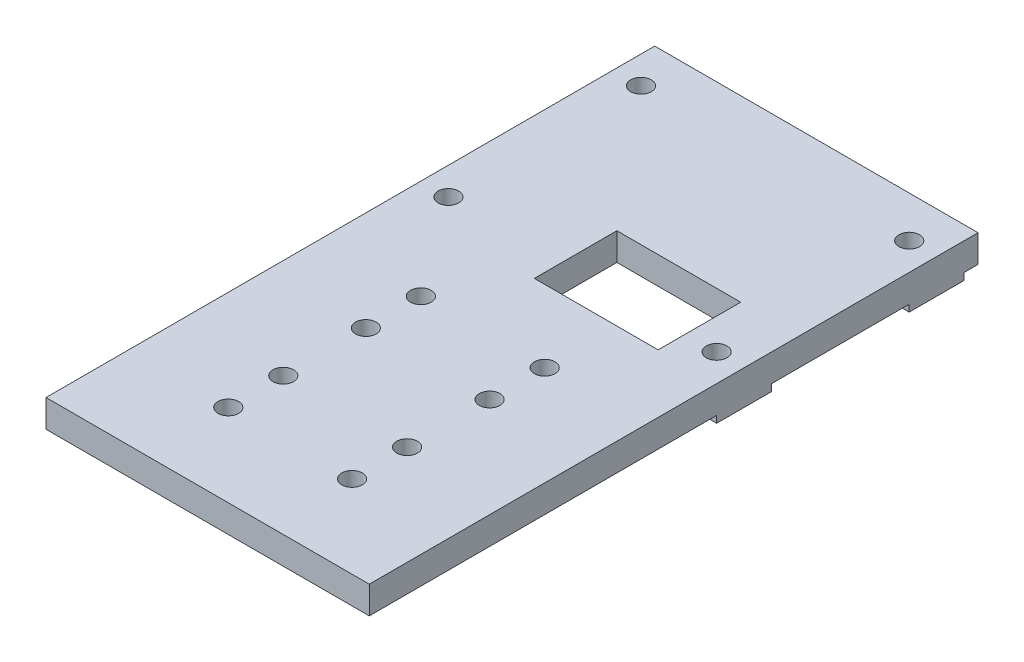
ISO-10303-21;
HEADER;
FILE_DESCRIPTION(('STEP AP214'),'2;1');
FILE_NAME('part.step','',(''),(''),'','','');
FILE_SCHEMA(('AUTOMOTIVE_DESIGN { 1 0 10303 214 1 1 1 1 }'));
ENDSEC;
DATA;
#1=APPLICATION_CONTEXT('core data for automotive mechanical design processes');
#2=APPLICATION_PROTOCOL_DEFINITION('international standard','automotive_design',2000,#1);
#3=PRODUCT_CONTEXT('',#1,'mechanical');
#4=PRODUCT('Part','Part','',(#3));
#5=PRODUCT_RELATED_PRODUCT_CATEGORY('part','',(#4));
#6=PRODUCT_DEFINITION_FORMATION('','',#4);
#7=PRODUCT_DEFINITION_CONTEXT('part definition',#1,'design');
#8=PRODUCT_DEFINITION('design','',#6,#7);
#9=PRODUCT_DEFINITION_SHAPE('','',#8);
#10=(LENGTH_UNIT() NAMED_UNIT(*) SI_UNIT(.MILLI.,.METRE.));
#11=(NAMED_UNIT(*) PLANE_ANGLE_UNIT() SI_UNIT($,.RADIAN.));
#12=(NAMED_UNIT(*) SI_UNIT($,.STERADIAN.) SOLID_ANGLE_UNIT());
#13=UNCERTAINTY_MEASURE_WITH_UNIT(LENGTH_MEASURE(1.E-05),#10,'distance_accuracy_value','');
#14=(GEOMETRIC_REPRESENTATION_CONTEXT(3) GLOBAL_UNCERTAINTY_ASSIGNED_CONTEXT((#13)) GLOBAL_UNIT_ASSIGNED_CONTEXT((#10,
#11,#12)) REPRESENTATION_CONTEXT('',''));
#15=CARTESIAN_POINT('',(0.,0.,0.));
#16=DIRECTION('',(0.,0.,1.));
#17=DIRECTION('',(1.,0.,0.));
#18=AXIS2_PLACEMENT_3D('',#15,#16,#17);
#19=CARTESIAN_POINT('',(0.,0.,0.));
#20=DIRECTION('',(0.,1.,0.));
#21=DIRECTION('',(0.,0.,1.));
#22=AXIS2_PLACEMENT_3D('',#19,#20,#21);
#23=PLANE('',#22);
#24=CARTESIAN_POINT('',(-9.,0.,28.5));
#25=DIRECTION('',(0.,1.,0.));
#26=DIRECTION('',(0.,0.,-1.));
#27=AXIS2_PLACEMENT_3D('',#24,#25,#26);
#28=CIRCLE('',#27,1.5);
#29=CARTESIAN_POINT('',(-9.,0.,27.));
#30=VERTEX_POINT('',#29);
#31=EDGE_CURVE('E211',#30,#30,#28,.T.);
#32=ORIENTED_EDGE('',*,*,#31,.T.);
#33=EDGE_LOOP('',(#32));
#34=FACE_BOUND('',#33,.T.);
#35=CARTESIAN_POINT('',(-9.,0.,48.5));
#36=DIRECTION('',(0.,1.,0.));
#37=DIRECTION('',(0.,0.,-1.));
#38=AXIS2_PLACEMENT_3D('',#35,#36,#37);
#39=CIRCLE('',#38,1.5);
#40=CARTESIAN_POINT('',(-9.,0.,47.));
#41=VERTEX_POINT('',#40);
#42=EDGE_CURVE('E841',#41,#41,#39,.T.);
#43=ORIENTED_EDGE('',*,*,#42,.T.);
#44=EDGE_LOOP('',(#43));
#45=FACE_BOUND('',#44,.T.);
#46=CARTESIAN_POINT('',(9.00000000000001,0.,48.5));
#47=DIRECTION('',(0.,1.,0.));
#48=DIRECTION('',(0.,0.,1.));
#49=AXIS2_PLACEMENT_3D('',#46,#47,#48);
#50=CIRCLE('',#49,1.5);
#51=CARTESIAN_POINT('',(9.00000000000001,0.,50.));
#52=VERTEX_POINT('',#51);
#53=EDGE_CURVE('E857',#52,#52,#50,.T.);
#54=ORIENTED_EDGE('',*,*,#53,.T.);
#55=EDGE_LOOP('',(#54));
#56=FACE_BOUND('',#55,.T.);
#57=CARTESIAN_POINT('',(9.00000000000001,0.,36.5));
#58=DIRECTION('',(0.,1.,0.));
#59=DIRECTION('',(0.,0.,1.));
#60=AXIS2_PLACEMENT_3D('',#57,#58,#59);
#61=CIRCLE('',#60,1.5);
#62=CARTESIAN_POINT('',(9.00000000000001,0.,38.));
#63=VERTEX_POINT('',#62);
#64=EDGE_CURVE('E1027',#63,#63,#61,.T.);
#65=ORIENTED_EDGE('',*,*,#64,.T.);
#66=EDGE_LOOP('',(#65));
#67=FACE_BOUND('',#66,.T.);
#68=CARTESIAN_POINT('',(9.00000000000001,0.,56.5));
#69=DIRECTION('',(0.,1.,0.));
#70=DIRECTION('',(0.,0.,1.));
#71=AXIS2_PLACEMENT_3D('',#68,#69,#70);
#72=CIRCLE('',#71,1.5);
#73=CARTESIAN_POINT('',(9.00000000000001,0.,58.));
#74=VERTEX_POINT('',#73);
#75=EDGE_CURVE('E1023',#74,#74,#72,.T.);
#76=ORIENTED_EDGE('',*,*,#75,.T.);
#77=EDGE_LOOP('',(#76));
#78=FACE_BOUND('',#77,.T.);
#79=CARTESIAN_POINT('',(-9.,0.,56.5));
#80=DIRECTION('',(0.,1.,0.));
#81=DIRECTION('',(0.,0.,-1.));
#82=AXIS2_PLACEMENT_3D('',#79,#80,#81);
#83=CIRCLE('',#82,1.5);
#84=CARTESIAN_POINT('',(-9.,0.,55.));
#85=VERTEX_POINT('',#84);
#86=EDGE_CURVE('E1017',#85,#85,#83,.T.);
#87=ORIENTED_EDGE('',*,*,#86,.T.);
#88=EDGE_LOOP('',(#87));
#89=FACE_BOUND('',#88,.T.);
#90=CARTESIAN_POINT('',(-8.99999999999999,0.,36.5));
#91=DIRECTION('',(0.,1.,0.));
#92=DIRECTION('',(0.,0.,-1.));
#93=AXIS2_PLACEMENT_3D('',#90,#91,#92);
#94=CIRCLE('',#93,1.5);
#95=CARTESIAN_POINT('',(-8.99999999999999,0.,35.));
#96=VERTEX_POINT('',#95);
#97=EDGE_CURVE('E848',#96,#96,#94,.T.);
#98=ORIENTED_EDGE('',*,*,#97,.T.);
#99=EDGE_LOOP('',(#98));
#100=FACE_BOUND('',#99,.T.);
#101=CARTESIAN_POINT('',(9.,0.,28.5));
#102=DIRECTION('',(0.,1.,0.));
#103=DIRECTION('',(0.,0.,1.));
#104=AXIS2_PLACEMENT_3D('',#101,#102,#103);
#105=CIRCLE('',#104,1.5);
#106=CARTESIAN_POINT('',(9.,0.,30.));
#107=VERTEX_POINT('',#106);
#108=EDGE_CURVE('E862',#107,#107,#105,.T.);
#109=ORIENTED_EDGE('',*,*,#108,.T.);
#110=EDGE_LOOP('',(#109));
#111=FACE_BOUND('',#110,.T.);
#112=DIRECTION('',(0.,0.,1.));
#113=VECTOR('',#112,1.);
#114=CARTESIAN_POINT('',(-3.,0.,0.));
#115=LINE('',#114,#113);
#116=CARTESIAN_POINT('',(-3.,0.,6.));
#117=VERTEX_POINT('',#116);
#118=CARTESIAN_POINT('',(-3.,0.,18.));
#119=VERTEX_POINT('',#118);
#120=EDGE_CURVE('E246',#117,#119,#115,.T.);
#121=ORIENTED_EDGE('',*,*,#120,.T.);
#122=DIRECTION('',(-1.,0.,0.));
#123=VECTOR('',#122,1.);
#124=CARTESIAN_POINT('',(0.,0.,18.));
#125=LINE('',#124,#123);
#126=CARTESIAN_POINT('',(15.,0.,18.));
#127=VERTEX_POINT('',#126);
#128=EDGE_CURVE('E254',#127,#119,#125,.T.);
#129=ORIENTED_EDGE('',*,*,#128,.F.);
#130=DIRECTION('',(0.,0.,1.));
#131=VECTOR('',#130,1.);
#132=CARTESIAN_POINT('',(15.,0.,0.));
#133=LINE('',#132,#131);
#134=CARTESIAN_POINT('',(15.,0.,6.));
#135=VERTEX_POINT('',#134);
#136=EDGE_CURVE('E252',#135,#127,#133,.T.);
#137=ORIENTED_EDGE('',*,*,#136,.F.);
#138=DIRECTION('',(1.,0.,0.));
#139=VECTOR('',#138,1.);
#140=CARTESIAN_POINT('',(0.,0.,6.));
#141=LINE('',#140,#139);
#142=EDGE_CURVE('E249',#117,#135,#141,.T.);
#143=ORIENTED_EDGE('',*,*,#142,.F.);
#144=EDGE_LOOP('',(#121,#129,#137,#143));
#145=FACE_BOUND('',#144,.T.);
#146=DIRECTION('',(0.,0.,-1.));
#147=VECTOR('',#146,1.);
#148=CARTESIAN_POINT('',(23.5,0.,0.));
#149=LINE('',#148,#147);
#150=CARTESIAN_POINT('',(23.5,0.,68.5));
#151=VERTEX_POINT('',#150);
#152=CARTESIAN_POINT('',(23.5,0.,18.));
#153=VERTEX_POINT('',#152);
#154=EDGE_CURVE('E261',#151,#153,#149,.T.);
#155=ORIENTED_EDGE('',*,*,#154,.F.);
#156=DIRECTION('',(-1.,0.,0.));
#157=VECTOR('',#156,1.);
#158=CARTESIAN_POINT('',(-23.5,0.,68.5));
#159=LINE('',#158,#157);
#160=CARTESIAN_POINT('',(-23.5,0.,68.5));
#161=VERTEX_POINT('',#160);
#162=EDGE_CURVE('E212',#151,#161,#159,.T.);
#163=ORIENTED_EDGE('',*,*,#162,.T.);
#164=DIRECTION('',(0.,0.,-1.));
#165=VECTOR('',#164,1.);
#166=CARTESIAN_POINT('',(-23.5,0.,0.));
#167=LINE('',#166,#165);
#168=CARTESIAN_POINT('',(-23.5,0.,18.));
#169=VERTEX_POINT('',#168);
#170=EDGE_CURVE('E221',#161,#169,#167,.T.);
#171=ORIENTED_EDGE('',*,*,#170,.T.);
#172=DIRECTION('',(-1.,0.,0.));
#173=VECTOR('',#172,1.);
#174=CARTESIAN_POINT('',(-15.5,0.,18.));
#175=LINE('',#174,#173);
#176=CARTESIAN_POINT('',(-15.5,0.,18.));
#177=VERTEX_POINT('',#176);
#178=EDGE_CURVE('E68',#177,#169,#175,.T.);
#179=ORIENTED_EDGE('',*,*,#178,.F.);
#180=DIRECTION('',(0.,0.,1.));
#181=VECTOR('',#180,1.);
#182=CARTESIAN_POINT('',(-15.5,0.,10.));
#183=LINE('',#182,#181);
#184=CARTESIAN_POINT('',(-15.5,0.,10.));
#185=VERTEX_POINT('',#184);
#186=EDGE_CURVE('E883',#185,#177,#183,.T.);
#187=ORIENTED_EDGE('',*,*,#186,.F.);
#188=DIRECTION('',(1.,0.,0.));
#189=VECTOR('',#188,1.);
#190=CARTESIAN_POINT('',(-15.5,0.,10.));
#191=LINE('',#190,#189);
#192=CARTESIAN_POINT('',(-23.5,0.,10.));
#193=VERTEX_POINT('',#192);
#194=EDGE_CURVE('E878',#193,#185,#191,.T.);
#195=ORIENTED_EDGE('',*,*,#194,.F.);
#196=CARTESIAN_POINT('',(-23.5,0.,-10.));
#197=VERTEX_POINT('',#196);
#198=EDGE_CURVE('E260',#193,#197,#167,.T.);
#199=ORIENTED_EDGE('',*,*,#198,.T.);
#200=DIRECTION('',(-1.,0.,0.));
#201=VECTOR('',#200,1.);
#202=CARTESIAN_POINT('',(-15.5,0.,-10.));
#203=LINE('',#202,#201);
#204=CARTESIAN_POINT('',(-15.5,0.,-10.));
#205=VERTEX_POINT('',#204);
#206=EDGE_CURVE('E916',#205,#197,#203,.T.);
#207=ORIENTED_EDGE('',*,*,#206,.F.);
#208=DIRECTION('',(0.,0.,1.));
#209=VECTOR('',#208,1.);
#210=CARTESIAN_POINT('',(-15.5,0.,-10.));
#211=LINE('',#210,#209);
#212=CARTESIAN_POINT('',(-15.5,0.,-18.));
#213=VERTEX_POINT('',#212);
#214=EDGE_CURVE('E909',#213,#205,#211,.T.);
#215=ORIENTED_EDGE('',*,*,#214,.F.);
#216=DIRECTION('',(1.,0.,0.));
#217=VECTOR('',#216,1.);
#218=CARTESIAN_POINT('',(-15.5,0.,-18.));
#219=LINE('',#218,#217);
#220=CARTESIAN_POINT('',(-23.5,0.,-18.));
#221=VERTEX_POINT('',#220);
#222=EDGE_CURVE('E912',#221,#213,#219,.T.);
#223=ORIENTED_EDGE('',*,*,#222,.F.);
#224=CARTESIAN_POINT('',(-23.5,0.,-20.));
#225=VERTEX_POINT('',#224);
#226=EDGE_CURVE('E257',#221,#225,#167,.T.);
#227=ORIENTED_EDGE('',*,*,#226,.T.);
#228=DIRECTION('',(1.,0.,0.));
#229=VECTOR('',#228,1.);
#230=CARTESIAN_POINT('',(0.,0.,-20.));
#231=LINE('',#230,#229);
#232=CARTESIAN_POINT('',(23.5,0.,-20.));
#233=VERTEX_POINT('',#232);
#234=EDGE_CURVE('E263',#225,#233,#231,.T.);
#235=ORIENTED_EDGE('',*,*,#234,.T.);
#236=CARTESIAN_POINT('',(23.5,0.,-18.));
#237=VERTEX_POINT('',#236);
#238=EDGE_CURVE('E259',#237,#233,#149,.T.);
#239=ORIENTED_EDGE('',*,*,#238,.F.);
#240=DIRECTION('',(1.,0.,0.));
#241=VECTOR('',#240,1.);
#242=CARTESIAN_POINT('',(15.5,0.,-18.));
#243=LINE('',#242,#241);
#244=CARTESIAN_POINT('',(15.5,0.,-18.));
#245=VERTEX_POINT('',#244);
#246=EDGE_CURVE('E941',#245,#237,#243,.T.);
#247=ORIENTED_EDGE('',*,*,#246,.F.);
#248=DIRECTION('',(0.,0.,-1.));
#249=VECTOR('',#248,1.);
#250=CARTESIAN_POINT('',(15.5,0.,-10.));
#251=LINE('',#250,#249);
#252=CARTESIAN_POINT('',(15.5,0.,-10.));
#253=VERTEX_POINT('',#252);
#254=EDGE_CURVE('E323',#253,#245,#251,.T.);
#255=ORIENTED_EDGE('',*,*,#254,.F.);
#256=DIRECTION('',(-1.,0.,0.));
#257=VECTOR('',#256,1.);
#258=CARTESIAN_POINT('',(15.5,0.,-10.));
#259=LINE('',#258,#257);
#260=CARTESIAN_POINT('',(23.5,0.,-10.));
#261=VERTEX_POINT('',#260);
#262=EDGE_CURVE('E939',#261,#253,#259,.T.);
#263=ORIENTED_EDGE('',*,*,#262,.F.);
#264=CARTESIAN_POINT('',(23.5,0.,10.));
#265=VERTEX_POINT('',#264);
#266=EDGE_CURVE('E264',#265,#261,#149,.T.);
#267=ORIENTED_EDGE('',*,*,#266,.F.);
#268=DIRECTION('',(1.,0.,0.));
#269=VECTOR('',#268,1.);
#270=CARTESIAN_POINT('',(15.5,0.,10.));
#271=LINE('',#270,#269);
#272=CARTESIAN_POINT('',(15.5,0.,10.));
#273=VERTEX_POINT('',#272);
#274=EDGE_CURVE('E331',#273,#265,#271,.T.);
#275=ORIENTED_EDGE('',*,*,#274,.F.);
#276=DIRECTION('',(0.,0.,-1.));
#277=VECTOR('',#276,1.);
#278=CARTESIAN_POINT('',(15.5,0.,10.));
#279=LINE('',#278,#277);
#280=CARTESIAN_POINT('',(15.5,0.,18.));
#281=VERTEX_POINT('',#280);
#282=EDGE_CURVE('E320',#281,#273,#279,.T.);
#283=ORIENTED_EDGE('',*,*,#282,.F.);
#284=DIRECTION('',(-1.,0.,0.));
#285=VECTOR('',#284,1.);
#286=CARTESIAN_POINT('',(15.5,0.,18.));
#287=LINE('',#286,#285);
#288=EDGE_CURVE('E316',#153,#281,#287,.T.);
#289=ORIENTED_EDGE('',*,*,#288,.F.);
#290=EDGE_LOOP('',(#155,#163,#171,#179,#187,#195,#199,#207,#215,#223,#227,#235,#239,#247,#255,
#263,#267,#275,#283,#289));
#291=FACE_BOUND('',#290,.T.);
#292=ADVANCED_FACE('F43',(#34,#45,#56,#67,#78,#89,#100,#111,#145,#291),#23,.F.);
#293=CARTESIAN_POINT('',(-23.5,4.,0.));
#294=DIRECTION('',(-1.,0.,0.));
#295=DIRECTION('',(0.,0.,1.));
#296=AXIS2_PLACEMENT_3D('',#293,#294,#295);
#297=PLANE('',#296);
#298=DIRECTION('',(0.,1.,0.));
#299=VECTOR('',#298,1.);
#300=CARTESIAN_POINT('',(-23.5,0.,68.5));
#301=LINE('',#300,#299);
#302=CARTESIAN_POINT('',(-23.5,4.,68.5));
#303=VERTEX_POINT('',#302);
#304=EDGE_CURVE('E206',#161,#303,#301,.T.);
#305=ORIENTED_EDGE('',*,*,#304,.T.);
#306=DIRECTION('',(0.,0.,-1.));
#307=VECTOR('',#306,1.);
#308=CARTESIAN_POINT('',(-23.5,4.,0.));
#309=LINE('',#308,#307);
#310=CARTESIAN_POINT('',(-23.5,4.,-20.));
#311=VERTEX_POINT('',#310);
#312=EDGE_CURVE('E218',#303,#311,#309,.T.);
#313=ORIENTED_EDGE('',*,*,#312,.T.);
#314=DIRECTION('',(0.,-1.,0.));
#315=VECTOR('',#314,1.);
#316=CARTESIAN_POINT('',(-23.5,4.,-20.));
#317=LINE('',#316,#315);
#318=EDGE_CURVE('E52',#311,#225,#317,.T.);
#319=ORIENTED_EDGE('',*,*,#318,.T.);
#320=ORIENTED_EDGE('',*,*,#226,.F.);
#321=DIRECTION('',(0.,1.,0.));
#322=VECTOR('',#321,1.);
#323=CARTESIAN_POINT('',(-23.5,-1.,-18.));
#324=LINE('',#323,#322);
#325=CARTESIAN_POINT('',(-23.5,-1.,-18.));
#326=VERTEX_POINT('',#325);
#327=EDGE_CURVE('E899',#326,#221,#324,.T.);
#328=ORIENTED_EDGE('',*,*,#327,.F.);
#329=DIRECTION('',(0.,0.,-1.));
#330=VECTOR('',#329,1.);
#331=CARTESIAN_POINT('',(-23.5,-1.,-10.));
#332=LINE('',#331,#330);
#333=CARTESIAN_POINT('',(-23.5,-1.,-10.));
#334=VERTEX_POINT('',#333);
#335=EDGE_CURVE('E923',#334,#326,#332,.T.);
#336=ORIENTED_EDGE('',*,*,#335,.F.);
#337=DIRECTION('',(0.,1.,0.));
#338=VECTOR('',#337,1.);
#339=CARTESIAN_POINT('',(-23.5,-1.,-10.));
#340=LINE('',#339,#338);
#341=EDGE_CURVE('E896',#334,#197,#340,.T.);
#342=ORIENTED_EDGE('',*,*,#341,.T.);
#343=ORIENTED_EDGE('',*,*,#198,.F.);
#344=DIRECTION('',(0.,1.,0.));
#345=VECTOR('',#344,1.);
#346=CARTESIAN_POINT('',(-23.5,-1.,10.));
#347=LINE('',#346,#345);
#348=CARTESIAN_POINT('',(-23.5,-1.,10.));
#349=VERTEX_POINT('',#348);
#350=EDGE_CURVE('E871',#349,#193,#347,.T.);
#351=ORIENTED_EDGE('',*,*,#350,.F.);
#352=DIRECTION('',(0.,0.,-1.));
#353=VECTOR('',#352,1.);
#354=CARTESIAN_POINT('',(-23.5,-1.,10.));
#355=LINE('',#354,#353);
#356=CARTESIAN_POINT('',(-23.5,-1.,18.));
#357=VERTEX_POINT('',#356);
#358=EDGE_CURVE('E888',#357,#349,#355,.T.);
#359=ORIENTED_EDGE('',*,*,#358,.F.);
#360=DIRECTION('',(0.,1.,0.));
#361=VECTOR('',#360,1.);
#362=CARTESIAN_POINT('',(-23.5,-1.,18.));
#363=LINE('',#362,#361);
#364=EDGE_CURVE('E869',#357,#169,#363,.T.);
#365=ORIENTED_EDGE('',*,*,#364,.T.);
#366=ORIENTED_EDGE('',*,*,#170,.F.);
#367=EDGE_LOOP('',(#305,#313,#319,#320,#328,#336,#342,#343,#351,#359,#365,#366));
#368=FACE_BOUND('',#367,.T.);
#369=ADVANCED_FACE('F216',(#368),#297,.T.);
#370=CARTESIAN_POINT('',(23.5,4.,0.));
#371=DIRECTION('',(-1.,0.,0.));
#372=DIRECTION('',(0.,0.,1.));
#373=AXIS2_PLACEMENT_3D('',#370,#371,#372);
#374=PLANE('',#373);
#375=DIRECTION('',(0.,0.,-1.));
#376=VECTOR('',#375,1.);
#377=CARTESIAN_POINT('',(23.5,4.,0.));
#378=LINE('',#377,#376);
#379=CARTESIAN_POINT('',(23.5,4.,68.5));
#380=VERTEX_POINT('',#379);
#381=CARTESIAN_POINT('',(23.5,4.,-20.));
#382=VERTEX_POINT('',#381);
#383=EDGE_CURVE('E229',#380,#382,#378,.T.);
#384=ORIENTED_EDGE('',*,*,#383,.F.);
#385=DIRECTION('',(0.,1.,0.));
#386=VECTOR('',#385,1.);
#387=CARTESIAN_POINT('',(23.5,0.,68.5));
#388=LINE('',#387,#386);
#389=EDGE_CURVE('E60',#151,#380,#388,.T.);
#390=ORIENTED_EDGE('',*,*,#389,.F.);
#391=ORIENTED_EDGE('',*,*,#154,.T.);
#392=DIRECTION('',(0.,1.,0.));
#393=VECTOR('',#392,1.);
#394=CARTESIAN_POINT('',(23.5,-1.,18.));
#395=LINE('',#394,#393);
#396=CARTESIAN_POINT('',(23.5,-1.,18.));
#397=VERTEX_POINT('',#396);
#398=EDGE_CURVE('E250',#397,#153,#395,.T.);
#399=ORIENTED_EDGE('',*,*,#398,.F.);
#400=DIRECTION('',(0.,0.,1.));
#401=VECTOR('',#400,1.);
#402=CARTESIAN_POINT('',(23.5,-1.,10.));
#403=LINE('',#402,#401);
#404=CARTESIAN_POINT('',(23.5,-1.,10.));
#405=VERTEX_POINT('',#404);
#406=EDGE_CURVE('E327',#405,#397,#403,.T.);
#407=ORIENTED_EDGE('',*,*,#406,.F.);
#408=DIRECTION('',(0.,1.,0.));
#409=VECTOR('',#408,1.);
#410=CARTESIAN_POINT('',(23.5,-1.,10.));
#411=LINE('',#410,#409);
#412=EDGE_CURVE('E336',#405,#265,#411,.T.);
#413=ORIENTED_EDGE('',*,*,#412,.T.);
#414=ORIENTED_EDGE('',*,*,#266,.T.);
#415=DIRECTION('',(0.,1.,0.));
#416=VECTOR('',#415,1.);
#417=CARTESIAN_POINT('',(23.5,-1.,-10.));
#418=LINE('',#417,#416);
#419=CARTESIAN_POINT('',(23.5,-1.,-10.));
#420=VERTEX_POINT('',#419);
#421=EDGE_CURVE('E933',#420,#261,#418,.T.);
#422=ORIENTED_EDGE('',*,*,#421,.F.);
#423=DIRECTION('',(0.,0.,1.));
#424=VECTOR('',#423,1.);
#425=CARTESIAN_POINT('',(23.5,-1.,-10.));
#426=LINE('',#425,#424);
#427=CARTESIAN_POINT('',(23.5,-1.,-18.));
#428=VERTEX_POINT('',#427);
#429=EDGE_CURVE('E948',#428,#420,#426,.T.);
#430=ORIENTED_EDGE('',*,*,#429,.F.);
#431=DIRECTION('',(0.,1.,0.));
#432=VECTOR('',#431,1.);
#433=CARTESIAN_POINT('',(23.5,-1.,-18.));
#434=LINE('',#433,#432);
#435=EDGE_CURVE('E931',#428,#237,#434,.T.);
#436=ORIENTED_EDGE('',*,*,#435,.T.);
#437=ORIENTED_EDGE('',*,*,#238,.T.);
#438=DIRECTION('',(0.,-1.,0.));
#439=VECTOR('',#438,1.);
#440=CARTESIAN_POINT('',(23.5,4.,-20.));
#441=LINE('',#440,#439);
#442=EDGE_CURVE('E11',#382,#233,#441,.T.);
#443=ORIENTED_EDGE('',*,*,#442,.F.);
#444=EDGE_LOOP('',(#384,#390,#391,#399,#407,#413,#414,#422,#430,#436,#437,#443));
#445=FACE_BOUND('',#444,.T.);
#446=ADVANCED_FACE('F358',(#445),#374,.F.);
#447=CARTESIAN_POINT('',(-3.,4.,0.));
#448=DIRECTION('',(1.,0.,0.));
#449=DIRECTION('',(0.,0.,-1.));
#450=AXIS2_PLACEMENT_3D('',#447,#448,#449);
#451=PLANE('',#450);
#452=ORIENTED_EDGE('',*,*,#120,.F.);
#453=DIRECTION('',(0.,-1.,0.));
#454=VECTOR('',#453,1.);
#455=CARTESIAN_POINT('',(-3.,4.,6.));
#456=LINE('',#455,#454);
#457=CARTESIAN_POINT('',(-3.,4.,6.));
#458=VERTEX_POINT('',#457);
#459=EDGE_CURVE('E47',#458,#117,#456,.T.);
#460=ORIENTED_EDGE('',*,*,#459,.F.);
#461=DIRECTION('',(0.,0.,1.));
#462=VECTOR('',#461,1.);
#463=CARTESIAN_POINT('',(-3.,4.,0.));
#464=LINE('',#463,#462);
#465=CARTESIAN_POINT('',(-3.,4.,18.));
#466=VERTEX_POINT('',#465);
#467=EDGE_CURVE('E267',#458,#466,#464,.T.);
#468=ORIENTED_EDGE('',*,*,#467,.T.);
#469=DIRECTION('',(0.,-1.,0.));
#470=VECTOR('',#469,1.);
#471=CARTESIAN_POINT('',(-3.,4.,18.));
#472=LINE('',#471,#470);
#473=EDGE_CURVE('E245',#466,#119,#472,.T.);
#474=ORIENTED_EDGE('',*,*,#473,.T.);
#475=EDGE_LOOP('',(#452,#460,#468,#474));
#476=FACE_BOUND('',#475,.T.);
#477=ADVANCED_FACE('F45',(#476),#451,.T.);
#478=CARTESIAN_POINT('',(0.,4.,6.));
#479=DIRECTION('',(0.,0.,-1.));
#480=DIRECTION('',(-1.,0.,0.));
#481=AXIS2_PLACEMENT_3D('',#478,#479,#480);
#482=PLANE('',#481);
#483=ORIENTED_EDGE('',*,*,#142,.T.);
#484=DIRECTION('',(0.,-1.,0.));
#485=VECTOR('',#484,1.);
#486=CARTESIAN_POINT('',(15.,4.,6.));
#487=LINE('',#486,#485);
#488=CARTESIAN_POINT('',(15.,4.,6.));
#489=VERTEX_POINT('',#488);
#490=EDGE_CURVE('E272',#489,#135,#487,.T.);
#491=ORIENTED_EDGE('',*,*,#490,.F.);
#492=DIRECTION('',(1.,0.,0.));
#493=VECTOR('',#492,1.);
#494=CARTESIAN_POINT('',(0.,4.,6.));
#495=LINE('',#494,#493);
#496=EDGE_CURVE('E282',#458,#489,#495,.T.);
#497=ORIENTED_EDGE('',*,*,#496,.F.);
#498=ORIENTED_EDGE('',*,*,#459,.T.);
#499=EDGE_LOOP('',(#483,#491,#497,#498));
#500=FACE_BOUND('',#499,.T.);
#501=ADVANCED_FACE('F281',(#500),#482,.F.);
#502=CARTESIAN_POINT('',(15.,4.,0.));
#503=DIRECTION('',(1.,0.,0.));
#504=DIRECTION('',(0.,0.,-1.));
#505=AXIS2_PLACEMENT_3D('',#502,#503,#504);
#506=PLANE('',#505);
#507=ORIENTED_EDGE('',*,*,#136,.T.);
#508=DIRECTION('',(0.,-1.,0.));
#509=VECTOR('',#508,1.);
#510=CARTESIAN_POINT('',(15.,4.,18.));
#511=LINE('',#510,#509);
#512=CARTESIAN_POINT('',(15.,4.,18.));
#513=VERTEX_POINT('',#512);
#514=EDGE_CURVE('E270',#513,#127,#511,.T.);
#515=ORIENTED_EDGE('',*,*,#514,.F.);
#516=DIRECTION('',(0.,0.,1.));
#517=VECTOR('',#516,1.);
#518=CARTESIAN_POINT('',(15.,4.,0.));
#519=LINE('',#518,#517);
#520=EDGE_CURVE('E296',#489,#513,#519,.T.);
#521=ORIENTED_EDGE('',*,*,#520,.F.);
#522=ORIENTED_EDGE('',*,*,#490,.T.);
#523=EDGE_LOOP('',(#507,#515,#521,#522));
#524=FACE_BOUND('',#523,.T.);
#525=ADVANCED_FACE('F295',(#524),#506,.F.);
#526=CARTESIAN_POINT('',(-19.5,4.,14.));
#527=DIRECTION('',(0.,-1.,0.));
#528=DIRECTION('',(0.,0.,-1.));
#529=AXIS2_PLACEMENT_3D('',#526,#527,#528);
#530=CYLINDRICAL_SURFACE('',#529,1.5);
#531=CARTESIAN_POINT('',(-19.5,4.,14.));
#532=DIRECTION('',(0.,1.,0.));
#533=DIRECTION('',(0.,0.,1.));
#534=AXIS2_PLACEMENT_3D('',#531,#532,#533);
#535=CIRCLE('',#534,1.5);
#536=CARTESIAN_POINT('',(-19.5,4.,15.5));
#537=VERTEX_POINT('',#536);
#538=EDGE_CURVE('E239',#537,#537,#535,.T.);
#539=ORIENTED_EDGE('',*,*,#538,.T.);
#540=EDGE_LOOP('',(#539));
#541=FACE_BOUND('',#540,.T.);
#542=CARTESIAN_POINT('',(-19.5,-1.,14.));
#543=DIRECTION('',(0.,-1.,0.));
#544=DIRECTION('',(0.,0.,-1.));
#545=AXIS2_PLACEMENT_3D('',#542,#543,#544);
#546=CIRCLE('',#545,1.5);
#547=CARTESIAN_POINT('',(-19.5,-1.,12.5));
#548=VERTEX_POINT('',#547);
#549=EDGE_CURVE('E886',#548,#548,#546,.T.);
#550=ORIENTED_EDGE('',*,*,#549,.T.);
#551=EDGE_LOOP('',(#550));
#552=FACE_BOUND('',#551,.T.);
#553=ADVANCED_FACE('F394',(#541,#552),#530,.F.);
#554=CARTESIAN_POINT('',(0.,4.,-20.));
#555=DIRECTION('',(0.,0.,-1.));
#556=DIRECTION('',(-1.,0.,0.));
#557=AXIS2_PLACEMENT_3D('',#554,#555,#556);
#558=PLANE('',#557);
#559=ORIENTED_EDGE('',*,*,#234,.F.);
#560=ORIENTED_EDGE('',*,*,#318,.F.);
#561=DIRECTION('',(1.,0.,0.));
#562=VECTOR('',#561,1.);
#563=CARTESIAN_POINT('',(0.,4.,-20.));
#564=LINE('',#563,#562);
#565=EDGE_CURVE('E228',#311,#382,#564,.T.);
#566=ORIENTED_EDGE('',*,*,#565,.T.);
#567=ORIENTED_EDGE('',*,*,#442,.T.);
#568=EDGE_LOOP('',(#559,#560,#566,#567));
#569=FACE_BOUND('',#568,.T.);
#570=ADVANCED_FACE('F397',(#569),#558,.T.);
#571=CARTESIAN_POINT('',(19.5,4.,-14.));
#572=DIRECTION('',(0.,-1.,0.));
#573=DIRECTION('',(0.,0.,-1.));
#574=AXIS2_PLACEMENT_3D('',#571,#572,#573);
#575=CYLINDRICAL_SURFACE('',#574,1.5);
#576=CARTESIAN_POINT('',(19.5,4.,-14.));
#577=DIRECTION('',(0.,1.,0.));
#578=DIRECTION('',(0.,0.,1.));
#579=AXIS2_PLACEMENT_3D('',#576,#577,#578);
#580=CIRCLE('',#579,1.5);
#581=CARTESIAN_POINT('',(19.5,4.,-12.5));
#582=VERTEX_POINT('',#581);
#583=EDGE_CURVE('E230',#582,#582,#580,.T.);
#584=ORIENTED_EDGE('',*,*,#583,.T.);
#585=EDGE_LOOP('',(#584));
#586=FACE_BOUND('',#585,.T.);
#587=CARTESIAN_POINT('',(19.5,-1.,-14.));
#588=DIRECTION('',(0.,-1.,0.));
#589=DIRECTION('',(0.,0.,-1.));
#590=AXIS2_PLACEMENT_3D('',#587,#588,#589);
#591=CIRCLE('',#590,1.5);
#592=CARTESIAN_POINT('',(19.5,-1.,-15.5));
#593=VERTEX_POINT('',#592);
#594=EDGE_CURVE('E317',#593,#593,#591,.T.);
#595=ORIENTED_EDGE('',*,*,#594,.T.);
#596=EDGE_LOOP('',(#595));
#597=FACE_BOUND('',#596,.T.);
#598=ADVANCED_FACE('F310',(#586,#597),#575,.F.);
#599=CARTESIAN_POINT('',(19.5,4.,14.));
#600=DIRECTION('',(0.,-1.,0.));
#601=DIRECTION('',(0.,0.,-1.));
#602=AXIS2_PLACEMENT_3D('',#599,#600,#601);
#603=CYLINDRICAL_SURFACE('',#602,1.5);
#604=CARTESIAN_POINT('',(19.5,4.,14.));
#605=DIRECTION('',(0.,1.,0.));
#606=DIRECTION('',(0.,0.,1.));
#607=AXIS2_PLACEMENT_3D('',#604,#605,#606);
#608=CIRCLE('',#607,1.5);
#609=CARTESIAN_POINT('',(19.5,4.,15.5));
#610=VERTEX_POINT('',#609);
#611=EDGE_CURVE('E234',#610,#610,#608,.F.);
#612=ORIENTED_EDGE('',*,*,#611,.F.);
#613=EDGE_LOOP('',(#612));
#614=FACE_BOUND('',#613,.T.);
#615=CARTESIAN_POINT('',(19.5,-1.,14.));
#616=DIRECTION('',(0.,-1.,0.));
#617=DIRECTION('',(0.,0.,-1.));
#618=AXIS2_PLACEMENT_3D('',#615,#616,#617);
#619=CIRCLE('',#618,1.5);
#620=CARTESIAN_POINT('',(19.5,-1.,12.5));
#621=VERTEX_POINT('',#620);
#622=EDGE_CURVE('E314',#621,#621,#619,.T.);
#623=ORIENTED_EDGE('',*,*,#622,.T.);
#624=EDGE_LOOP('',(#623));
#625=FACE_BOUND('',#624,.T.);
#626=ADVANCED_FACE('F307',(#614,#625),#603,.F.);
#627=CARTESIAN_POINT('',(0.,4.,18.));
#628=DIRECTION('',(0.,0.,1.));
#629=DIRECTION('',(1.,0.,0.));
#630=AXIS2_PLACEMENT_3D('',#627,#628,#629);
#631=PLANE('',#630);
#632=ORIENTED_EDGE('',*,*,#128,.T.);
#633=ORIENTED_EDGE('',*,*,#473,.F.);
#634=DIRECTION('',(-1.,0.,0.));
#635=VECTOR('',#634,1.);
#636=CARTESIAN_POINT('',(0.,4.,18.));
#637=LINE('',#636,#635);
#638=EDGE_CURVE('E294',#513,#466,#637,.T.);
#639=ORIENTED_EDGE('',*,*,#638,.F.);
#640=ORIENTED_EDGE('',*,*,#514,.T.);
#641=EDGE_LOOP('',(#632,#633,#639,#640));
#642=FACE_BOUND('',#641,.T.);
#643=ADVANCED_FACE('F292',(#642),#631,.F.);
#644=CARTESIAN_POINT('',(-19.5,4.,-14.));
#645=DIRECTION('',(0.,-1.,0.));
#646=DIRECTION('',(0.,0.,-1.));
#647=AXIS2_PLACEMENT_3D('',#644,#645,#646);
#648=CYLINDRICAL_SURFACE('',#647,1.5);
#649=CARTESIAN_POINT('',(-19.5,4.,-14.));
#650=DIRECTION('',(0.,1.,0.));
#651=DIRECTION('',(0.,0.,1.));
#652=AXIS2_PLACEMENT_3D('',#649,#650,#651);
#653=CIRCLE('',#652,1.5);
#654=CARTESIAN_POINT('',(-19.5,4.,-12.5));
#655=VERTEX_POINT('',#654);
#656=EDGE_CURVE('E242',#655,#655,#653,.F.);
#657=ORIENTED_EDGE('',*,*,#656,.F.);
#658=EDGE_LOOP('',(#657));
#659=FACE_BOUND('',#658,.T.);
#660=CARTESIAN_POINT('',(-19.5,-1.,-14.));
#661=DIRECTION('',(0.,-1.,0.));
#662=DIRECTION('',(0.,0.,-1.));
#663=AXIS2_PLACEMENT_3D('',#660,#661,#662);
#664=CIRCLE('',#663,1.5);
#665=CARTESIAN_POINT('',(-19.5,-1.,-15.5));
#666=VERTEX_POINT('',#665);
#667=EDGE_CURVE('E919',#666,#666,#664,.T.);
#668=ORIENTED_EDGE('',*,*,#667,.T.);
#669=EDGE_LOOP('',(#668));
#670=FACE_BOUND('',#669,.T.);
#671=ADVANCED_FACE('F377',(#659,#670),#648,.F.);
#672=CARTESIAN_POINT('',(0.,4.,0.));
#673=DIRECTION('',(0.,1.,0.));
#674=DIRECTION('',(0.,0.,1.));
#675=AXIS2_PLACEMENT_3D('',#672,#673,#674);
#676=PLANE('',#675);
#677=DIRECTION('',(-1.,0.,0.));
#678=VECTOR('',#677,1.);
#679=CARTESIAN_POINT('',(-23.5,4.,68.5));
#680=LINE('',#679,#678);
#681=EDGE_CURVE('E203',#380,#303,#680,.T.);
#682=ORIENTED_EDGE('',*,*,#681,.F.);
#683=ORIENTED_EDGE('',*,*,#383,.T.);
#684=ORIENTED_EDGE('',*,*,#565,.F.);
#685=ORIENTED_EDGE('',*,*,#312,.F.);
#686=EDGE_LOOP('',(#682,#683,#684,#685));
#687=FACE_BOUND('',#686,.T.);
#688=CARTESIAN_POINT('',(-9.,4.,28.5));
#689=DIRECTION('',(0.,1.,0.));
#690=DIRECTION('',(0.,0.,-1.));
#691=AXIS2_PLACEMENT_3D('',#688,#689,#690);
#692=CIRCLE('',#691,1.5);
#693=CARTESIAN_POINT('',(-9.,4.,27.));
#694=VERTEX_POINT('',#693);
#695=EDGE_CURVE('E840',#694,#694,#692,.T.);
#696=ORIENTED_EDGE('',*,*,#695,.F.);
#697=EDGE_LOOP('',(#696));
#698=FACE_BOUND('',#697,.T.);
#699=CARTESIAN_POINT('',(-9.,4.,48.5));
#700=DIRECTION('',(0.,1.,0.));
#701=DIRECTION('',(0.,0.,-1.));
#702=AXIS2_PLACEMENT_3D('',#699,#700,#701);
#703=CIRCLE('',#702,1.5);
#704=CARTESIAN_POINT('',(-9.,4.,47.));
#705=VERTEX_POINT('',#704);
#706=EDGE_CURVE('E844',#705,#705,#703,.T.);
#707=ORIENTED_EDGE('',*,*,#706,.F.);
#708=EDGE_LOOP('',(#707));
#709=FACE_BOUND('',#708,.T.);
#710=CARTESIAN_POINT('',(9.00000000000001,4.,48.5));
#711=DIRECTION('',(0.,1.,0.));
#712=DIRECTION('',(0.,0.,1.));
#713=AXIS2_PLACEMENT_3D('',#710,#711,#712);
#714=CIRCLE('',#713,1.5);
#715=CARTESIAN_POINT('',(9.00000000000001,4.,50.));
#716=VERTEX_POINT('',#715);
#717=EDGE_CURVE('E853',#716,#716,#714,.T.);
#718=ORIENTED_EDGE('',*,*,#717,.F.);
#719=EDGE_LOOP('',(#718));
#720=FACE_BOUND('',#719,.T.);
#721=CARTESIAN_POINT('',(9.00000000000001,4.,36.5));
#722=DIRECTION('',(0.,1.,0.));
#723=DIRECTION('',(0.,0.,1.));
#724=AXIS2_PLACEMENT_3D('',#721,#722,#723);
#725=CIRCLE('',#724,1.5);
#726=CARTESIAN_POINT('',(9.00000000000001,4.,38.));
#727=VERTEX_POINT('',#726);
#728=EDGE_CURVE('E222',#727,#727,#725,.T.);
#729=ORIENTED_EDGE('',*,*,#728,.F.);
#730=EDGE_LOOP('',(#729));
#731=FACE_BOUND('',#730,.T.);
#732=CARTESIAN_POINT('',(9.00000000000001,4.,56.5));
#733=DIRECTION('',(0.,1.,0.));
#734=DIRECTION('',(0.,0.,1.));
#735=AXIS2_PLACEMENT_3D('',#732,#733,#734);
#736=CIRCLE('',#735,1.5);
#737=CARTESIAN_POINT('',(9.00000000000001,4.,58.));
#738=VERTEX_POINT('',#737);
#739=EDGE_CURVE('E1008',#738,#738,#736,.T.);
#740=ORIENTED_EDGE('',*,*,#739,.F.);
#741=EDGE_LOOP('',(#740));
#742=FACE_BOUND('',#741,.T.);
#743=CARTESIAN_POINT('',(-9.,4.,56.5));
#744=DIRECTION('',(0.,1.,0.));
#745=DIRECTION('',(0.,0.,-1.));
#746=AXIS2_PLACEMENT_3D('',#743,#744,#745);
#747=CIRCLE('',#746,1.5);
#748=CARTESIAN_POINT('',(-9.,4.,55.));
#749=VERTEX_POINT('',#748);
#750=EDGE_CURVE('E1012',#749,#749,#747,.T.);
#751=ORIENTED_EDGE('',*,*,#750,.F.);
#752=EDGE_LOOP('',(#751));
#753=FACE_BOUND('',#752,.T.);
#754=CARTESIAN_POINT('',(-8.99999999999999,4.,36.5));
#755=DIRECTION('',(0.,1.,0.));
#756=DIRECTION('',(0.,0.,-1.));
#757=AXIS2_PLACEMENT_3D('',#754,#755,#756);
#758=CIRCLE('',#757,1.5);
#759=CARTESIAN_POINT('',(-8.99999999999999,4.,35.));
#760=VERTEX_POINT('',#759);
#761=EDGE_CURVE('E1015',#760,#760,#758,.T.);
#762=ORIENTED_EDGE('',*,*,#761,.F.);
#763=EDGE_LOOP('',(#762));
#764=FACE_BOUND('',#763,.T.);
#765=CARTESIAN_POINT('',(9.,4.,28.5));
#766=DIRECTION('',(0.,1.,0.));
#767=DIRECTION('',(0.,0.,1.));
#768=AXIS2_PLACEMENT_3D('',#765,#766,#767);
#769=CIRCLE('',#768,1.5);
#770=CARTESIAN_POINT('',(9.,4.,30.));
#771=VERTEX_POINT('',#770);
#772=EDGE_CURVE('E856',#771,#771,#769,.T.);
#773=ORIENTED_EDGE('',*,*,#772,.F.);
#774=EDGE_LOOP('',(#773));
#775=FACE_BOUND('',#774,.T.);
#776=ORIENTED_EDGE('',*,*,#467,.F.);
#777=ORIENTED_EDGE('',*,*,#496,.T.);
#778=ORIENTED_EDGE('',*,*,#520,.T.);
#779=ORIENTED_EDGE('',*,*,#638,.T.);
#780=EDGE_LOOP('',(#776,#777,#778,#779));
#781=FACE_BOUND('',#780,.T.);
#782=ORIENTED_EDGE('',*,*,#611,.T.);
#783=EDGE_LOOP('',(#782));
#784=FACE_BOUND('',#783,.T.);
#785=ORIENTED_EDGE('',*,*,#583,.F.);
#786=EDGE_LOOP('',(#785));
#787=FACE_BOUND('',#786,.T.);
#788=ORIENTED_EDGE('',*,*,#538,.F.);
#789=EDGE_LOOP('',(#788));
#790=FACE_BOUND('',#789,.T.);
#791=ORIENTED_EDGE('',*,*,#656,.T.);
#792=EDGE_LOOP('',(#791));
#793=FACE_BOUND('',#792,.T.);
#794=ADVANCED_FACE('F225',(#687,#698,#709,#720,#731,#742,#753,#764,#775,#781,#784,#787,#790,
#793),#676,.T.);
#795=CARTESIAN_POINT('',(0.,-1.,0.));
#796=DIRECTION('',(0.,1.,0.));
#797=DIRECTION('',(0.,0.,1.));
#798=AXIS2_PLACEMENT_3D('',#795,#796,#797);
#799=PLANE('',#798);
#800=ORIENTED_EDGE('',*,*,#406,.T.);
#801=DIRECTION('',(-1.,0.,0.));
#802=VECTOR('',#801,1.);
#803=CARTESIAN_POINT('',(15.5,-1.,18.));
#804=LINE('',#803,#802);
#805=CARTESIAN_POINT('',(15.5,-1.,18.));
#806=VERTEX_POINT('',#805);
#807=EDGE_CURVE('E330',#397,#806,#804,.T.);
#808=ORIENTED_EDGE('',*,*,#807,.T.);
#809=DIRECTION('',(0.,0.,-1.));
#810=VECTOR('',#809,1.);
#811=CARTESIAN_POINT('',(15.5,-1.,10.));
#812=LINE('',#811,#810);
#813=CARTESIAN_POINT('',(15.5,-1.,10.));
#814=VERTEX_POINT('',#813);
#815=EDGE_CURVE('E333',#806,#814,#812,.T.);
#816=ORIENTED_EDGE('',*,*,#815,.T.);
#817=DIRECTION('',(1.,0.,0.));
#818=VECTOR('',#817,1.);
#819=CARTESIAN_POINT('',(15.5,-1.,10.));
#820=LINE('',#819,#818);
#821=EDGE_CURVE('E335',#814,#405,#820,.T.);
#822=ORIENTED_EDGE('',*,*,#821,.T.);
#823=EDGE_LOOP('',(#800,#808,#816,#822));
#824=FACE_BOUND('',#823,.T.);
#825=ORIENTED_EDGE('',*,*,#622,.F.);
#826=EDGE_LOOP('',(#825));
#827=FACE_BOUND('',#826,.T.);
#828=ADVANCED_FACE('F369',(#824,#827),#799,.F.);
#829=CARTESIAN_POINT('',(15.5,-1.,18.));
#830=DIRECTION('',(0.,0.,-1.));
#831=DIRECTION('',(-1.,0.,0.));
#832=AXIS2_PLACEMENT_3D('',#829,#830,#831);
#833=PLANE('',#832);
#834=ORIENTED_EDGE('',*,*,#288,.T.);
#835=DIRECTION('',(0.,1.,0.));
#836=VECTOR('',#835,1.);
#837=CARTESIAN_POINT('',(15.5,-1.,18.));
#838=LINE('',#837,#836);
#839=EDGE_CURVE('E347',#806,#281,#838,.T.);
#840=ORIENTED_EDGE('',*,*,#839,.F.);
#841=ORIENTED_EDGE('',*,*,#807,.F.);
#842=ORIENTED_EDGE('',*,*,#398,.T.);
#843=EDGE_LOOP('',(#834,#840,#841,#842));
#844=FACE_BOUND('',#843,.T.);
#845=ADVANCED_FACE('F353',(#844),#833,.F.);
#846=CARTESIAN_POINT('',(15.5,-1.,10.));
#847=DIRECTION('',(1.,0.,0.));
#848=DIRECTION('',(0.,0.,-1.));
#849=AXIS2_PLACEMENT_3D('',#846,#847,#848);
#850=PLANE('',#849);
#851=ORIENTED_EDGE('',*,*,#282,.T.);
#852=DIRECTION('',(0.,1.,0.));
#853=VECTOR('',#852,1.);
#854=CARTESIAN_POINT('',(15.5,-1.,10.));
#855=LINE('',#854,#853);
#856=EDGE_CURVE('E344',#814,#273,#855,.T.);
#857=ORIENTED_EDGE('',*,*,#856,.F.);
#858=ORIENTED_EDGE('',*,*,#815,.F.);
#859=ORIENTED_EDGE('',*,*,#839,.T.);
#860=EDGE_LOOP('',(#851,#857,#858,#859));
#861=FACE_BOUND('',#860,.T.);
#862=ADVANCED_FACE('F362',(#861),#850,.F.);
#863=CARTESIAN_POINT('',(15.5,-1.,10.));
#864=DIRECTION('',(0.,0.,1.));
#865=DIRECTION('',(1.,0.,0.));
#866=AXIS2_PLACEMENT_3D('',#863,#864,#865);
#867=PLANE('',#866);
#868=ORIENTED_EDGE('',*,*,#274,.T.);
#869=ORIENTED_EDGE('',*,*,#412,.F.);
#870=ORIENTED_EDGE('',*,*,#821,.F.);
#871=ORIENTED_EDGE('',*,*,#856,.T.);
#872=EDGE_LOOP('',(#868,#869,#870,#871));
#873=FACE_BOUND('',#872,.T.);
#874=ADVANCED_FACE('F366',(#873),#867,.F.);
#875=CARTESIAN_POINT('',(0.,-1.,0.));
#876=DIRECTION('',(0.,-1.,0.));
#877=DIRECTION('',(0.,0.,-1.));
#878=AXIS2_PLACEMENT_3D('',#875,#876,#877);
#879=PLANE('',#878);
#880=DIRECTION('',(0.,0.,-1.));
#881=VECTOR('',#880,1.);
#882=CARTESIAN_POINT('',(15.5,-1.,-10.));
#883=LINE('',#882,#881);
#884=CARTESIAN_POINT('',(15.5,-1.,-10.));
#885=VERTEX_POINT('',#884);
#886=CARTESIAN_POINT('',(15.5,-1.,-18.));
#887=VERTEX_POINT('',#886);
#888=EDGE_CURVE('E942',#885,#887,#883,.T.);
#889=ORIENTED_EDGE('',*,*,#888,.T.);
#890=DIRECTION('',(1.,0.,0.));
#891=VECTOR('',#890,1.);
#892=CARTESIAN_POINT('',(15.5,-1.,-18.));
#893=LINE('',#892,#891);
#894=EDGE_CURVE('E950',#887,#428,#893,.T.);
#895=ORIENTED_EDGE('',*,*,#894,.T.);
#896=ORIENTED_EDGE('',*,*,#429,.T.);
#897=DIRECTION('',(-1.,0.,0.));
#898=VECTOR('',#897,1.);
#899=CARTESIAN_POINT('',(15.5,-1.,-10.));
#900=LINE('',#899,#898);
#901=EDGE_CURVE('E938',#420,#885,#900,.T.);
#902=ORIENTED_EDGE('',*,*,#901,.T.);
#903=EDGE_LOOP('',(#889,#895,#896,#902));
#904=FACE_BOUND('',#903,.T.);
#905=ORIENTED_EDGE('',*,*,#594,.F.);
#906=EDGE_LOOP('',(#905));
#907=FACE_BOUND('',#906,.T.);
#908=ADVANCED_FACE('F555',(#904,#907),#879,.T.);
#909=CARTESIAN_POINT('',(15.5,-1.,-10.));
#910=DIRECTION('',(1.,0.,0.));
#911=DIRECTION('',(0.,0.,-1.));
#912=AXIS2_PLACEMENT_3D('',#909,#910,#911);
#913=PLANE('',#912);
#914=ORIENTED_EDGE('',*,*,#254,.T.);
#915=DIRECTION('',(0.,1.,0.));
#916=VECTOR('',#915,1.);
#917=CARTESIAN_POINT('',(15.5,-1.,-18.));
#918=LINE('',#917,#916);
#919=EDGE_CURVE('E929',#887,#245,#918,.T.);
#920=ORIENTED_EDGE('',*,*,#919,.F.);
#921=ORIENTED_EDGE('',*,*,#888,.F.);
#922=DIRECTION('',(0.,1.,0.));
#923=VECTOR('',#922,1.);
#924=CARTESIAN_POINT('',(15.5,-1.,-10.));
#925=LINE('',#924,#923);
#926=EDGE_CURVE('E935',#885,#253,#925,.T.);
#927=ORIENTED_EDGE('',*,*,#926,.T.);
#928=EDGE_LOOP('',(#914,#920,#921,#927));
#929=FACE_BOUND('',#928,.T.);
#930=ADVANCED_FACE('F544',(#929),#913,.F.);
#931=CARTESIAN_POINT('',(15.5,-1.,-18.));
#932=DIRECTION('',(0.,0.,1.));
#933=DIRECTION('',(1.,0.,0.));
#934=AXIS2_PLACEMENT_3D('',#931,#932,#933);
#935=PLANE('',#934);
#936=ORIENTED_EDGE('',*,*,#246,.T.);
#937=ORIENTED_EDGE('',*,*,#435,.F.);
#938=ORIENTED_EDGE('',*,*,#894,.F.);
#939=ORIENTED_EDGE('',*,*,#919,.T.);
#940=EDGE_LOOP('',(#936,#937,#938,#939));
#941=FACE_BOUND('',#940,.T.);
#942=ADVANCED_FACE('F533',(#941),#935,.F.);
#943=CARTESIAN_POINT('',(15.5,-1.,-10.));
#944=DIRECTION('',(0.,0.,-1.));
#945=DIRECTION('',(-1.,0.,0.));
#946=AXIS2_PLACEMENT_3D('',#943,#944,#945);
#947=PLANE('',#946);
#948=ORIENTED_EDGE('',*,*,#262,.T.);
#949=ORIENTED_EDGE('',*,*,#926,.F.);
#950=ORIENTED_EDGE('',*,*,#901,.F.);
#951=ORIENTED_EDGE('',*,*,#421,.T.);
#952=EDGE_LOOP('',(#948,#949,#950,#951));
#953=FACE_BOUND('',#952,.T.);
#954=ADVANCED_FACE('F522',(#953),#947,.F.);
#955=CARTESIAN_POINT('',(0.,-1.,0.));
#956=DIRECTION('',(0.,-1.,0.));
#957=DIRECTION('',(0.,0.,-1.));
#958=AXIS2_PLACEMENT_3D('',#955,#956,#957);
#959=PLANE('',#958);
#960=DIRECTION('',(-1.,0.,0.));
#961=VECTOR('',#960,1.);
#962=CARTESIAN_POINT('',(-15.5,-1.,-10.));
#963=LINE('',#962,#961);
#964=CARTESIAN_POINT('',(-15.5,-1.,-10.));
#965=VERTEX_POINT('',#964);
#966=EDGE_CURVE('E913',#965,#334,#963,.T.);
#967=ORIENTED_EDGE('',*,*,#966,.T.);
#968=ORIENTED_EDGE('',*,*,#335,.T.);
#969=DIRECTION('',(1.,0.,0.));
#970=VECTOR('',#969,1.);
#971=CARTESIAN_POINT('',(-15.5,-1.,-18.));
#972=LINE('',#971,#970);
#973=CARTESIAN_POINT('',(-15.5,-1.,-18.));
#974=VERTEX_POINT('',#973);
#975=EDGE_CURVE('E921',#326,#974,#972,.T.);
#976=ORIENTED_EDGE('',*,*,#975,.T.);
#977=DIRECTION('',(0.,0.,1.));
#978=VECTOR('',#977,1.);
#979=CARTESIAN_POINT('',(-15.5,-1.,-10.));
#980=LINE('',#979,#978);
#981=EDGE_CURVE('E908',#974,#965,#980,.T.);
#982=ORIENTED_EDGE('',*,*,#981,.T.);
#983=EDGE_LOOP('',(#967,#968,#976,#982));
#984=FACE_BOUND('',#983,.T.);
#985=ORIENTED_EDGE('',*,*,#667,.F.);
#986=EDGE_LOOP('',(#985));
#987=FACE_BOUND('',#986,.T.);
#988=ADVANCED_FACE('F511',(#984,#987),#959,.T.);
#989=CARTESIAN_POINT('',(-15.5,-1.,-10.));
#990=DIRECTION('',(0.,0.,-1.));
#991=DIRECTION('',(-1.,0.,0.));
#992=AXIS2_PLACEMENT_3D('',#989,#990,#991);
#993=PLANE('',#992);
#994=ORIENTED_EDGE('',*,*,#206,.T.);
#995=ORIENTED_EDGE('',*,*,#341,.F.);
#996=ORIENTED_EDGE('',*,*,#966,.F.);
#997=DIRECTION('',(0.,1.,0.));
#998=VECTOR('',#997,1.);
#999=CARTESIAN_POINT('',(-15.5,-1.,-10.));
#1000=LINE('',#999,#998);
#1001=EDGE_CURVE('E905',#965,#205,#1000,.T.);
#1002=ORIENTED_EDGE('',*,*,#1001,.T.);
#1003=EDGE_LOOP('',(#994,#995,#996,#1002));
#1004=FACE_BOUND('',#1003,.T.);
#1005=ADVANCED_FACE('F500',(#1004),#993,.F.);
#1006=CARTESIAN_POINT('',(-15.5,-1.,-18.));
#1007=DIRECTION('',(0.,0.,1.));
#1008=DIRECTION('',(1.,0.,0.));
#1009=AXIS2_PLACEMENT_3D('',#1006,#1007,#1008);
#1010=PLANE('',#1009);
#1011=ORIENTED_EDGE('',*,*,#222,.T.);
#1012=DIRECTION('',(0.,1.,0.));
#1013=VECTOR('',#1012,1.);
#1014=CARTESIAN_POINT('',(-15.5,-1.,-18.));
#1015=LINE('',#1014,#1013);
#1016=EDGE_CURVE('E902',#974,#213,#1015,.T.);
#1017=ORIENTED_EDGE('',*,*,#1016,.F.);
#1018=ORIENTED_EDGE('',*,*,#975,.F.);
#1019=ORIENTED_EDGE('',*,*,#327,.T.);
#1020=EDGE_LOOP('',(#1011,#1017,#1018,#1019));
#1021=FACE_BOUND('',#1020,.T.);
#1022=ADVANCED_FACE('F489',(#1021),#1010,.F.);
#1023=CARTESIAN_POINT('',(-15.5,-1.,-10.));
#1024=DIRECTION('',(-1.,0.,0.));
#1025=DIRECTION('',(0.,0.,1.));
#1026=AXIS2_PLACEMENT_3D('',#1023,#1024,#1025);
#1027=PLANE('',#1026);
#1028=ORIENTED_EDGE('',*,*,#214,.T.);
#1029=ORIENTED_EDGE('',*,*,#1001,.F.);
#1030=ORIENTED_EDGE('',*,*,#981,.F.);
#1031=ORIENTED_EDGE('',*,*,#1016,.T.);
#1032=EDGE_LOOP('',(#1028,#1029,#1030,#1031));
#1033=FACE_BOUND('',#1032,.T.);
#1034=ADVANCED_FACE('F478',(#1033),#1027,.F.);
#1035=CARTESIAN_POINT('',(0.,-1.,0.));
#1036=DIRECTION('',(0.,-1.,0.));
#1037=DIRECTION('',(0.,0.,-1.));
#1038=AXIS2_PLACEMENT_3D('',#1035,#1036,#1037);
#1039=PLANE('',#1038);
#1040=DIRECTION('',(0.,0.,1.));
#1041=VECTOR('',#1040,1.);
#1042=CARTESIAN_POINT('',(-15.5,-1.,10.));
#1043=LINE('',#1042,#1041);
#1044=CARTESIAN_POINT('',(-15.5,-1.,10.));
#1045=VERTEX_POINT('',#1044);
#1046=CARTESIAN_POINT('',(-15.5,-1.,18.));
#1047=VERTEX_POINT('',#1046);
#1048=EDGE_CURVE('E881',#1045,#1047,#1043,.T.);
#1049=ORIENTED_EDGE('',*,*,#1048,.T.);
#1050=DIRECTION('',(-1.,0.,0.));
#1051=VECTOR('',#1050,1.);
#1052=CARTESIAN_POINT('',(-15.5,-1.,18.));
#1053=LINE('',#1052,#1051);
#1054=EDGE_CURVE('E890',#1047,#357,#1053,.T.);
#1055=ORIENTED_EDGE('',*,*,#1054,.T.);
#1056=ORIENTED_EDGE('',*,*,#358,.T.);
#1057=DIRECTION('',(1.,0.,0.));
#1058=VECTOR('',#1057,1.);
#1059=CARTESIAN_POINT('',(-15.5,-1.,10.));
#1060=LINE('',#1059,#1058);
#1061=EDGE_CURVE('E877',#349,#1045,#1060,.T.);
#1062=ORIENTED_EDGE('',*,*,#1061,.T.);
#1063=EDGE_LOOP('',(#1049,#1055,#1056,#1062));
#1064=FACE_BOUND('',#1063,.T.);
#1065=ORIENTED_EDGE('',*,*,#549,.F.);
#1066=EDGE_LOOP('',(#1065));
#1067=FACE_BOUND('',#1066,.T.);
#1068=ADVANCED_FACE('F467',(#1064,#1067),#1039,.T.);
#1069=CARTESIAN_POINT('',(-15.5,-1.,10.));
#1070=DIRECTION('',(-1.,0.,0.));
#1071=DIRECTION('',(0.,0.,1.));
#1072=AXIS2_PLACEMENT_3D('',#1069,#1070,#1071);
#1073=PLANE('',#1072);
#1074=ORIENTED_EDGE('',*,*,#186,.T.);
#1075=DIRECTION('',(0.,1.,0.));
#1076=VECTOR('',#1075,1.);
#1077=CARTESIAN_POINT('',(-15.5,-1.,18.));
#1078=LINE('',#1077,#1076);
#1079=EDGE_CURVE('E865',#1047,#177,#1078,.T.);
#1080=ORIENTED_EDGE('',*,*,#1079,.F.);
#1081=ORIENTED_EDGE('',*,*,#1048,.F.);
#1082=DIRECTION('',(0.,1.,0.));
#1083=VECTOR('',#1082,1.);
#1084=CARTESIAN_POINT('',(-15.5,-1.,10.));
#1085=LINE('',#1084,#1083);
#1086=EDGE_CURVE('E874',#1045,#185,#1085,.T.);
#1087=ORIENTED_EDGE('',*,*,#1086,.T.);
#1088=EDGE_LOOP('',(#1074,#1080,#1081,#1087));
#1089=FACE_BOUND('',#1088,.T.);
#1090=ADVANCED_FACE('F456',(#1089),#1073,.F.);
#1091=CARTESIAN_POINT('',(-15.5,-1.,18.));
#1092=DIRECTION('',(0.,0.,-1.));
#1093=DIRECTION('',(-1.,0.,0.));
#1094=AXIS2_PLACEMENT_3D('',#1091,#1092,#1093);
#1095=PLANE('',#1094);
#1096=ORIENTED_EDGE('',*,*,#178,.T.);
#1097=ORIENTED_EDGE('',*,*,#364,.F.);
#1098=ORIENTED_EDGE('',*,*,#1054,.F.);
#1099=ORIENTED_EDGE('',*,*,#1079,.T.);
#1100=EDGE_LOOP('',(#1096,#1097,#1098,#1099));
#1101=FACE_BOUND('',#1100,.T.);
#1102=ADVANCED_FACE('F443',(#1101),#1095,.F.);
#1103=CARTESIAN_POINT('',(-15.5,-1.,10.));
#1104=DIRECTION('',(0.,0.,1.));
#1105=DIRECTION('',(1.,0.,0.));
#1106=AXIS2_PLACEMENT_3D('',#1103,#1104,#1105);
#1107=PLANE('',#1106);
#1108=ORIENTED_EDGE('',*,*,#194,.T.);
#1109=ORIENTED_EDGE('',*,*,#1086,.F.);
#1110=ORIENTED_EDGE('',*,*,#1061,.F.);
#1111=ORIENTED_EDGE('',*,*,#350,.T.);
#1112=EDGE_LOOP('',(#1108,#1109,#1110,#1111));
#1113=FACE_BOUND('',#1112,.T.);
#1114=ADVANCED_FACE('F437',(#1113),#1107,.F.);
#1115=CARTESIAN_POINT('',(9.,0.,28.5));
#1116=DIRECTION('',(0.,1.,0.));
#1117=DIRECTION('',(0.,0.,1.));
#1118=AXIS2_PLACEMENT_3D('',#1115,#1116,#1117);
#1119=CYLINDRICAL_SURFACE('',#1118,1.5);
#1120=ORIENTED_EDGE('',*,*,#108,.F.);
#1121=EDGE_LOOP('',(#1120));
#1122=FACE_BOUND('',#1121,.T.);
#1123=ORIENTED_EDGE('',*,*,#772,.T.);
#1124=EDGE_LOOP('',(#1123));
#1125=FACE_BOUND('',#1124,.T.);
#1126=ADVANCED_FACE('F442',(#1122,#1125),#1119,.F.);
#1127=CARTESIAN_POINT('',(-8.99999999999999,0.,36.5));
#1128=DIRECTION('',(0.,1.,0.));
#1129=DIRECTION('',(0.,0.,1.));
#1130=AXIS2_PLACEMENT_3D('',#1127,#1128,#1129);
#1131=CYLINDRICAL_SURFACE('',#1130,1.5);
#1132=ORIENTED_EDGE('',*,*,#97,.F.);
#1133=EDGE_LOOP('',(#1132));
#1134=FACE_BOUND('',#1133,.T.);
#1135=ORIENTED_EDGE('',*,*,#761,.T.);
#1136=EDGE_LOOP('',(#1135));
#1137=FACE_BOUND('',#1136,.T.);
#1138=ADVANCED_FACE('F730',(#1134,#1137),#1131,.F.);
#1139=CARTESIAN_POINT('',(-9.,0.,56.5));
#1140=DIRECTION('',(0.,1.,0.));
#1141=DIRECTION('',(0.,0.,1.));
#1142=AXIS2_PLACEMENT_3D('',#1139,#1140,#1141);
#1143=CYLINDRICAL_SURFACE('',#1142,1.5);
#1144=ORIENTED_EDGE('',*,*,#86,.F.);
#1145=EDGE_LOOP('',(#1144));
#1146=FACE_BOUND('',#1145,.T.);
#1147=ORIENTED_EDGE('',*,*,#750,.T.);
#1148=EDGE_LOOP('',(#1147));
#1149=FACE_BOUND('',#1148,.T.);
#1150=ADVANCED_FACE('F740',(#1146,#1149),#1143,.F.);
#1151=CARTESIAN_POINT('',(9.00000000000001,0.,56.5));
#1152=DIRECTION('',(0.,1.,0.));
#1153=DIRECTION('',(0.,0.,1.));
#1154=AXIS2_PLACEMENT_3D('',#1151,#1152,#1153);
#1155=CYLINDRICAL_SURFACE('',#1154,1.5);
#1156=ORIENTED_EDGE('',*,*,#75,.F.);
#1157=EDGE_LOOP('',(#1156));
#1158=FACE_BOUND('',#1157,.T.);
#1159=ORIENTED_EDGE('',*,*,#739,.T.);
#1160=EDGE_LOOP('',(#1159));
#1161=FACE_BOUND('',#1160,.T.);
#1162=ADVANCED_FACE('F750',(#1158,#1161),#1155,.F.);
#1163=CARTESIAN_POINT('',(9.00000000000001,0.,36.5));
#1164=DIRECTION('',(0.,1.,0.));
#1165=DIRECTION('',(0.,0.,1.));
#1166=AXIS2_PLACEMENT_3D('',#1163,#1164,#1165);
#1167=CYLINDRICAL_SURFACE('',#1166,1.5);
#1168=ORIENTED_EDGE('',*,*,#64,.F.);
#1169=EDGE_LOOP('',(#1168));
#1170=FACE_BOUND('',#1169,.T.);
#1171=ORIENTED_EDGE('',*,*,#728,.T.);
#1172=EDGE_LOOP('',(#1171));
#1173=FACE_BOUND('',#1172,.T.);
#1174=ADVANCED_FACE('F760',(#1170,#1173),#1167,.F.);
#1175=CARTESIAN_POINT('',(9.00000000000001,0.,48.5));
#1176=DIRECTION('',(0.,1.,0.));
#1177=DIRECTION('',(0.,0.,1.));
#1178=AXIS2_PLACEMENT_3D('',#1175,#1176,#1177);
#1179=CYLINDRICAL_SURFACE('',#1178,1.5);
#1180=ORIENTED_EDGE('',*,*,#53,.F.);
#1181=EDGE_LOOP('',(#1180));
#1182=FACE_BOUND('',#1181,.T.);
#1183=ORIENTED_EDGE('',*,*,#717,.T.);
#1184=EDGE_LOOP('',(#1183));
#1185=FACE_BOUND('',#1184,.T.);
#1186=ADVANCED_FACE('F770',(#1182,#1185),#1179,.F.);
#1187=CARTESIAN_POINT('',(-9.,0.,48.5));
#1188=DIRECTION('',(0.,1.,0.));
#1189=DIRECTION('',(0.,0.,1.));
#1190=AXIS2_PLACEMENT_3D('',#1187,#1188,#1189);
#1191=CYLINDRICAL_SURFACE('',#1190,1.5);
#1192=ORIENTED_EDGE('',*,*,#42,.F.);
#1193=EDGE_LOOP('',(#1192));
#1194=FACE_BOUND('',#1193,.T.);
#1195=ORIENTED_EDGE('',*,*,#706,.T.);
#1196=EDGE_LOOP('',(#1195));
#1197=FACE_BOUND('',#1196,.T.);
#1198=ADVANCED_FACE('F780',(#1194,#1197),#1191,.F.);
#1199=CARTESIAN_POINT('',(-9.,0.,28.5));
#1200=DIRECTION('',(0.,1.,0.));
#1201=DIRECTION('',(0.,0.,1.));
#1202=AXIS2_PLACEMENT_3D('',#1199,#1200,#1201);
#1203=CYLINDRICAL_SURFACE('',#1202,1.5);
#1204=ORIENTED_EDGE('',*,*,#31,.F.);
#1205=EDGE_LOOP('',(#1204));
#1206=FACE_BOUND('',#1205,.T.);
#1207=ORIENTED_EDGE('',*,*,#695,.T.);
#1208=EDGE_LOOP('',(#1207));
#1209=FACE_BOUND('',#1208,.T.);
#1210=ADVANCED_FACE('F790',(#1206,#1209),#1203,.F.);
#1211=CARTESIAN_POINT('',(-23.5,0.,68.5));
#1212=DIRECTION('',(0.,0.,-1.));
#1213=DIRECTION('',(-1.,0.,0.));
#1214=AXIS2_PLACEMENT_3D('',#1211,#1212,#1213);
#1215=PLANE('',#1214);
#1216=ORIENTED_EDGE('',*,*,#681,.T.);
#1217=ORIENTED_EDGE('',*,*,#304,.F.);
#1218=ORIENTED_EDGE('',*,*,#162,.F.);
#1219=ORIENTED_EDGE('',*,*,#389,.T.);
#1220=EDGE_LOOP('',(#1216,#1217,#1218,#1219));
#1221=FACE_BOUND('',#1220,.T.);
#1222=ADVANCED_FACE('F205',(#1221),#1215,.F.);
#1223=CLOSED_SHELL('',(#292,#369,#446,#477,#501,#525,#553,#570,#598,#626,#643,#671,#794,#828,
#845,#862,#874,#908,#930,#942,#954,#988,#1005,#1022,#1034,#1068,#1090,#1102,#1114,#1126,#1138,
#1150,#1162,#1174,#1186,#1198,#1210,#1222));
#1224=MANIFOLD_SOLID_BREP('B2',#1223);
#1225=ADVANCED_BREP_SHAPE_REPRESENTATION('',(#18,#1224),#14);
#1226=SHAPE_DEFINITION_REPRESENTATION(#9,#1225);
ENDSEC;
END-ISO-10303-21;
